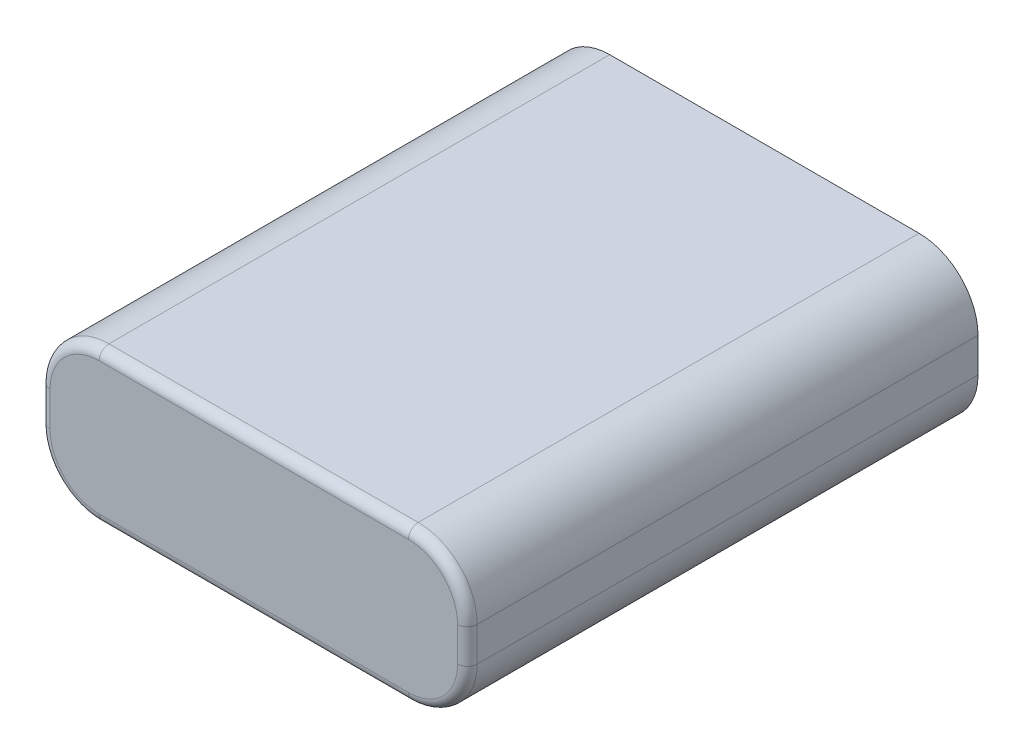
ISO-10303-21;
HEADER;
FILE_DESCRIPTION(('STEP AP214'),'2;1');
FILE_NAME('part.step','',(''),(''),'','','');
FILE_SCHEMA(('AUTOMOTIVE_DESIGN { 1 0 10303 214 1 1 1 1 }'));
ENDSEC;
DATA;
#1=APPLICATION_CONTEXT('core data for automotive mechanical design processes');
#2=APPLICATION_PROTOCOL_DEFINITION('international standard','automotive_design',2000,#1);
#3=PRODUCT_CONTEXT('',#1,'mechanical');
#4=PRODUCT('Part','Part','',(#3));
#5=PRODUCT_RELATED_PRODUCT_CATEGORY('part','',(#4));
#6=PRODUCT_DEFINITION_FORMATION('','',#4);
#7=PRODUCT_DEFINITION_CONTEXT('part definition',#1,'design');
#8=PRODUCT_DEFINITION('design','',#6,#7);
#9=PRODUCT_DEFINITION_SHAPE('','',#8);
#10=(LENGTH_UNIT() NAMED_UNIT(*) SI_UNIT(.MILLI.,.METRE.));
#11=(NAMED_UNIT(*) PLANE_ANGLE_UNIT() SI_UNIT($,.RADIAN.));
#12=(NAMED_UNIT(*) SI_UNIT($,.STERADIAN.) SOLID_ANGLE_UNIT());
#13=UNCERTAINTY_MEASURE_WITH_UNIT(LENGTH_MEASURE(1.E-05),#10,'distance_accuracy_value','');
#14=(GEOMETRIC_REPRESENTATION_CONTEXT(3) GLOBAL_UNCERTAINTY_ASSIGNED_CONTEXT((#13)) GLOBAL_UNIT_ASSIGNED_CONTEXT((#10,
#11,#12)) REPRESENTATION_CONTEXT('',''));
#15=CARTESIAN_POINT('',(0.,0.,0.));
#16=DIRECTION('',(0.,0.,1.));
#17=DIRECTION('',(1.,0.,0.));
#18=AXIS2_PLACEMENT_3D('',#15,#16,#17);
#19=CARTESIAN_POINT('',(15.75,1.75,52.));
#20=DIRECTION('',(0.,0.,-1.));
#21=DIRECTION('',(-1.,0.,0.));
#22=AXIS2_PLACEMENT_3D('',#19,#20,#21);
#23=CYLINDRICAL_SURFACE('',#22,6.);
#24=DIRECTION('',(0.,0.,-1.));
#25=VECTOR('',#24,1.);
#26=CARTESIAN_POINT('',(15.75,7.75,52.));
#27=LINE('',#26,#25);
#28=CARTESIAN_POINT('',(15.75,7.75,51.));
#29=VERTEX_POINT('',#28);
#30=CARTESIAN_POINT('',(15.75,7.75,0.));
#31=VERTEX_POINT('',#30);
#32=EDGE_CURVE('E122',#29,#31,#27,.T.);
#33=ORIENTED_EDGE('',*,*,#32,.F.);
#34=CARTESIAN_POINT('',(15.75,1.75,51.));
#35=DIRECTION('',(0.,0.,-1.));
#36=DIRECTION('',(-1.,0.,0.));
#37=AXIS2_PLACEMENT_3D('',#34,#35,#36);
#38=CIRCLE('',#37,6.);
#39=CARTESIAN_POINT('',(21.75,1.75,51.));
#40=VERTEX_POINT('',#39);
#41=EDGE_CURVE('E194',#29,#40,#38,.T.);
#42=ORIENTED_EDGE('',*,*,#41,.T.);
#43=DIRECTION('',(0.,0.,-1.));
#44=VECTOR('',#43,1.);
#45=CARTESIAN_POINT('',(21.75,1.75,52.));
#46=LINE('',#45,#44);
#47=CARTESIAN_POINT('',(21.75,1.75,0.));
#48=VERTEX_POINT('',#47);
#49=EDGE_CURVE('E145',#40,#48,#46,.T.);
#50=ORIENTED_EDGE('',*,*,#49,.T.);
#51=CARTESIAN_POINT('',(15.75,1.75,0.));
#52=DIRECTION('',(0.,0.,1.));
#53=DIRECTION('',(-1.,0.,0.));
#54=AXIS2_PLACEMENT_3D('',#51,#52,#53);
#55=CIRCLE('',#54,6.);
#56=EDGE_CURVE('E139',#48,#31,#55,.T.);
#57=ORIENTED_EDGE('',*,*,#56,.T.);
#58=EDGE_LOOP('',(#33,#42,#50,#57));
#59=FACE_BOUND('',#58,.T.);
#60=ADVANCED_FACE('F32',(#59),#23,.T.);
#61=CARTESIAN_POINT('',(-15.75,7.75,52.));
#62=DIRECTION('',(0.,-1.,0.));
#63=DIRECTION('',(0.,0.,-1.));
#64=AXIS2_PLACEMENT_3D('',#61,#62,#63);
#65=PLANE('',#64);
#66=DIRECTION('',(0.,0.,-1.));
#67=VECTOR('',#66,1.);
#68=CARTESIAN_POINT('',(-15.75,7.75,52.));
#69=LINE('',#68,#67);
#70=CARTESIAN_POINT('',(-15.75,7.75,51.));
#71=VERTEX_POINT('',#70);
#72=CARTESIAN_POINT('',(-15.75,7.75,0.));
#73=VERTEX_POINT('',#72);
#74=EDGE_CURVE('E133',#71,#73,#69,.T.);
#75=ORIENTED_EDGE('',*,*,#74,.F.);
#76=DIRECTION('',(-1.,0.,0.));
#77=VECTOR('',#76,1.);
#78=CARTESIAN_POINT('',(-15.75,7.75,51.));
#79=LINE('',#78,#77);
#80=EDGE_CURVE('E11',#71,#29,#79,.F.);
#81=ORIENTED_EDGE('',*,*,#80,.T.);
#82=ORIENTED_EDGE('',*,*,#32,.T.);
#83=DIRECTION('',(-1.,0.,0.));
#84=VECTOR('',#83,1.);
#85=CARTESIAN_POINT('',(-15.75,7.75,0.));
#86=LINE('',#85,#84);
#87=EDGE_CURVE('E125',#31,#73,#86,.T.);
#88=ORIENTED_EDGE('',*,*,#87,.T.);
#89=EDGE_LOOP('',(#75,#81,#82,#88));
#90=FACE_BOUND('',#89,.T.);
#91=ADVANCED_FACE('F124',(#90),#65,.F.);
#92=CARTESIAN_POINT('',(-15.75,1.75,52.));
#93=DIRECTION('',(0.,0.,-1.));
#94=DIRECTION('',(-1.,0.,0.));
#95=AXIS2_PLACEMENT_3D('',#92,#93,#94);
#96=CYLINDRICAL_SURFACE('',#95,6.);
#97=DIRECTION('',(0.,0.,-1.));
#98=VECTOR('',#97,1.);
#99=CARTESIAN_POINT('',(-21.75,1.75,52.));
#100=LINE('',#99,#98);
#101=CARTESIAN_POINT('',(-21.75,1.75,51.));
#102=VERTEX_POINT('',#101);
#103=CARTESIAN_POINT('',(-21.75,1.75,0.));
#104=VERTEX_POINT('',#103);
#105=EDGE_CURVE('E175',#102,#104,#100,.T.);
#106=ORIENTED_EDGE('',*,*,#105,.F.);
#107=CARTESIAN_POINT('',(-15.75,1.75,51.));
#108=DIRECTION('',(0.,0.,-1.));
#109=DIRECTION('',(-1.,0.,0.));
#110=AXIS2_PLACEMENT_3D('',#107,#108,#109);
#111=CIRCLE('',#110,6.);
#112=EDGE_CURVE('E41',#102,#71,#111,.T.);
#113=ORIENTED_EDGE('',*,*,#112,.T.);
#114=ORIENTED_EDGE('',*,*,#74,.T.);
#115=CARTESIAN_POINT('',(-15.75,1.75,0.));
#116=DIRECTION('',(0.,0.,1.));
#117=DIRECTION('',(-1.,0.,0.));
#118=AXIS2_PLACEMENT_3D('',#115,#116,#117);
#119=CIRCLE('',#118,6.);
#120=EDGE_CURVE('E142',#73,#104,#119,.T.);
#121=ORIENTED_EDGE('',*,*,#120,.T.);
#122=EDGE_LOOP('',(#106,#113,#114,#121));
#123=FACE_BOUND('',#122,.T.);
#124=ADVANCED_FACE('F265',(#123),#96,.T.);
#125=CARTESIAN_POINT('',(-21.75,-1.75,52.));
#126=DIRECTION('',(1.,0.,0.));
#127=DIRECTION('',(0.,0.,-1.));
#128=AXIS2_PLACEMENT_3D('',#125,#126,#127);
#129=PLANE('',#128);
#130=DIRECTION('',(0.,0.,-1.));
#131=VECTOR('',#130,1.);
#132=CARTESIAN_POINT('',(-21.75,-1.75,52.));
#133=LINE('',#132,#131);
#134=CARTESIAN_POINT('',(-21.75,-1.75,51.));
#135=VERTEX_POINT('',#134);
#136=CARTESIAN_POINT('',(-21.75,-1.75,0.));
#137=VERTEX_POINT('',#136);
#138=EDGE_CURVE('E173',#135,#137,#133,.T.);
#139=ORIENTED_EDGE('',*,*,#138,.F.);
#140=DIRECTION('',(0.,-1.,0.));
#141=VECTOR('',#140,1.);
#142=CARTESIAN_POINT('',(-21.75,-1.75,51.));
#143=LINE('',#142,#141);
#144=EDGE_CURVE('E56',#135,#102,#143,.F.);
#145=ORIENTED_EDGE('',*,*,#144,.T.);
#146=ORIENTED_EDGE('',*,*,#105,.T.);
#147=DIRECTION('',(0.,-1.,0.));
#148=VECTOR('',#147,1.);
#149=CARTESIAN_POINT('',(-21.75,-1.75,0.));
#150=LINE('',#149,#148);
#151=EDGE_CURVE('E152',#104,#137,#150,.T.);
#152=ORIENTED_EDGE('',*,*,#151,.T.);
#153=EDGE_LOOP('',(#139,#145,#146,#152));
#154=FACE_BOUND('',#153,.T.);
#155=ADVANCED_FACE('F264',(#154),#129,.F.);
#156=CARTESIAN_POINT('',(-15.75,-1.75,52.));
#157=DIRECTION('',(0.,0.,-1.));
#158=DIRECTION('',(-1.,0.,0.));
#159=AXIS2_PLACEMENT_3D('',#156,#157,#158);
#160=CYLINDRICAL_SURFACE('',#159,6.);
#161=DIRECTION('',(0.,0.,-1.));
#162=VECTOR('',#161,1.);
#163=CARTESIAN_POINT('',(-15.75,-7.75,52.));
#164=LINE('',#163,#162);
#165=CARTESIAN_POINT('',(-15.75,-7.75,51.));
#166=VERTEX_POINT('',#165);
#167=CARTESIAN_POINT('',(-15.75,-7.75,0.));
#168=VERTEX_POINT('',#167);
#169=EDGE_CURVE('E171',#166,#168,#164,.T.);
#170=ORIENTED_EDGE('',*,*,#169,.F.);
#171=CARTESIAN_POINT('',(-15.75,-1.75,51.));
#172=DIRECTION('',(0.,0.,-1.));
#173=DIRECTION('',(-1.,0.,0.));
#174=AXIS2_PLACEMENT_3D('',#171,#172,#173);
#175=CIRCLE('',#174,6.);
#176=EDGE_CURVE('E202',#166,#135,#175,.T.);
#177=ORIENTED_EDGE('',*,*,#176,.T.);
#178=ORIENTED_EDGE('',*,*,#138,.T.);
#179=CARTESIAN_POINT('',(-15.75,-1.75,0.));
#180=DIRECTION('',(0.,0.,1.));
#181=DIRECTION('',(-1.,0.,0.));
#182=AXIS2_PLACEMENT_3D('',#179,#180,#181);
#183=CIRCLE('',#182,6.);
#184=EDGE_CURVE('E155',#137,#168,#183,.T.);
#185=ORIENTED_EDGE('',*,*,#184,.T.);
#186=EDGE_LOOP('',(#170,#177,#178,#185));
#187=FACE_BOUND('',#186,.T.);
#188=ADVANCED_FACE('F263',(#187),#160,.T.);
#189=CARTESIAN_POINT('',(-15.75,-7.75,52.));
#190=DIRECTION('',(0.,1.,0.));
#191=DIRECTION('',(0.,0.,1.));
#192=AXIS2_PLACEMENT_3D('',#189,#190,#191);
#193=PLANE('',#192);
#194=DIRECTION('',(0.,0.,-1.));
#195=VECTOR('',#194,1.);
#196=CARTESIAN_POINT('',(15.75,-7.75,52.));
#197=LINE('',#196,#195);
#198=CARTESIAN_POINT('',(15.75,-7.75,51.));
#199=VERTEX_POINT('',#198);
#200=CARTESIAN_POINT('',(15.75,-7.75,0.));
#201=VERTEX_POINT('',#200);
#202=EDGE_CURVE('E169',#199,#201,#197,.T.);
#203=ORIENTED_EDGE('',*,*,#202,.F.);
#204=DIRECTION('',(1.,0.,0.));
#205=VECTOR('',#204,1.);
#206=CARTESIAN_POINT('',(-15.75,-7.75,51.));
#207=LINE('',#206,#205);
#208=EDGE_CURVE('E200',#199,#166,#207,.F.);
#209=ORIENTED_EDGE('',*,*,#208,.T.);
#210=ORIENTED_EDGE('',*,*,#169,.T.);
#211=DIRECTION('',(1.,0.,0.));
#212=VECTOR('',#211,1.);
#213=CARTESIAN_POINT('',(-15.75,-7.75,0.));
#214=LINE('',#213,#212);
#215=EDGE_CURVE('E158',#168,#201,#214,.T.);
#216=ORIENTED_EDGE('',*,*,#215,.T.);
#217=EDGE_LOOP('',(#203,#209,#210,#216));
#218=FACE_BOUND('',#217,.T.);
#219=ADVANCED_FACE('F260',(#218),#193,.F.);
#220=CARTESIAN_POINT('',(15.75,-1.75,52.));
#221=DIRECTION('',(0.,0.,-1.));
#222=DIRECTION('',(-1.,0.,0.));
#223=AXIS2_PLACEMENT_3D('',#220,#221,#222);
#224=CYLINDRICAL_SURFACE('',#223,6.);
#225=DIRECTION('',(0.,0.,-1.));
#226=VECTOR('',#225,1.);
#227=CARTESIAN_POINT('',(21.75,-1.75,52.));
#228=LINE('',#227,#226);
#229=CARTESIAN_POINT('',(21.75,-1.75,51.));
#230=VERTEX_POINT('',#229);
#231=CARTESIAN_POINT('',(21.75,-1.75,0.));
#232=VERTEX_POINT('',#231);
#233=EDGE_CURVE('E167',#230,#232,#228,.T.);
#234=ORIENTED_EDGE('',*,*,#233,.F.);
#235=CARTESIAN_POINT('',(15.75,-1.75,51.));
#236=DIRECTION('',(0.,0.,-1.));
#237=DIRECTION('',(-1.,0.,0.));
#238=AXIS2_PLACEMENT_3D('',#235,#236,#237);
#239=CIRCLE('',#238,6.);
#240=EDGE_CURVE('E198',#230,#199,#239,.T.);
#241=ORIENTED_EDGE('',*,*,#240,.T.);
#242=ORIENTED_EDGE('',*,*,#202,.T.);
#243=CARTESIAN_POINT('',(15.75,-1.75,0.));
#244=DIRECTION('',(0.,0.,1.));
#245=DIRECTION('',(1.,0.,0.));
#246=AXIS2_PLACEMENT_3D('',#243,#244,#245);
#247=CIRCLE('',#246,6.);
#248=EDGE_CURVE('E161',#201,#232,#247,.T.);
#249=ORIENTED_EDGE('',*,*,#248,.T.);
#250=EDGE_LOOP('',(#234,#241,#242,#249));
#251=FACE_BOUND('',#250,.T.);
#252=ADVANCED_FACE('F255',(#251),#224,.T.);
#253=CARTESIAN_POINT('',(21.75,-1.75,52.));
#254=DIRECTION('',(-1.,0.,0.));
#255=DIRECTION('',(0.,0.,1.));
#256=AXIS2_PLACEMENT_3D('',#253,#254,#255);
#257=PLANE('',#256);
#258=ORIENTED_EDGE('',*,*,#49,.F.);
#259=DIRECTION('',(0.,1.,0.));
#260=VECTOR('',#259,1.);
#261=CARTESIAN_POINT('',(21.75,-1.75,51.));
#262=LINE('',#261,#260);
#263=EDGE_CURVE('E196',#40,#230,#262,.F.);
#264=ORIENTED_EDGE('',*,*,#263,.T.);
#265=ORIENTED_EDGE('',*,*,#233,.T.);
#266=DIRECTION('',(0.,1.,0.));
#267=VECTOR('',#266,1.);
#268=CARTESIAN_POINT('',(21.75,-1.75,0.));
#269=LINE('',#268,#267);
#270=EDGE_CURVE('E164',#232,#48,#269,.T.);
#271=ORIENTED_EDGE('',*,*,#270,.T.);
#272=EDGE_LOOP('',(#258,#264,#265,#271));
#273=FACE_BOUND('',#272,.T.);
#274=ADVANCED_FACE('F249',(#273),#257,.F.);
#275=CARTESIAN_POINT('',(15.75,1.75,52.));
#276=DIRECTION('',(0.,0.,-1.));
#277=DIRECTION('',(-1.,0.,0.));
#278=AXIS2_PLACEMENT_3D('',#275,#276,#277);
#279=PLANE('',#278);
#280=DIRECTION('',(0.,1.,0.));
#281=VECTOR('',#280,1.);
#282=CARTESIAN_POINT('',(20.75,1.75,52.));
#283=LINE('',#282,#281);
#284=CARTESIAN_POINT('',(20.75,-1.75,52.));
#285=VERTEX_POINT('',#284);
#286=CARTESIAN_POINT('',(20.75,1.75,52.));
#287=VERTEX_POINT('',#286);
#288=EDGE_CURVE('E189',#285,#287,#283,.T.);
#289=ORIENTED_EDGE('',*,*,#288,.T.);
#290=CARTESIAN_POINT('',(15.75,1.75,52.));
#291=DIRECTION('',(0.,0.,-1.));
#292=DIRECTION('',(-1.,0.,0.));
#293=AXIS2_PLACEMENT_3D('',#290,#291,#292);
#294=CIRCLE('',#293,5.);
#295=CARTESIAN_POINT('',(15.75,6.75,52.));
#296=VERTEX_POINT('',#295);
#297=EDGE_CURVE('E191',#287,#296,#294,.F.);
#298=ORIENTED_EDGE('',*,*,#297,.T.);
#299=DIRECTION('',(-1.,0.,0.));
#300=VECTOR('',#299,1.);
#301=CARTESIAN_POINT('',(15.75,6.75,52.));
#302=LINE('',#301,#300);
#303=CARTESIAN_POINT('',(-15.75,6.75,52.));
#304=VERTEX_POINT('',#303);
#305=EDGE_CURVE('E132',#296,#304,#302,.T.);
#306=ORIENTED_EDGE('',*,*,#305,.T.);
#307=CARTESIAN_POINT('',(-15.75,1.75,52.));
#308=DIRECTION('',(0.,0.,-1.));
#309=DIRECTION('',(-1.,0.,0.));
#310=AXIS2_PLACEMENT_3D('',#307,#308,#309);
#311=CIRCLE('',#310,5.);
#312=CARTESIAN_POINT('',(-20.75,1.75,52.));
#313=VERTEX_POINT('',#312);
#314=EDGE_CURVE('E179',#304,#313,#311,.F.);
#315=ORIENTED_EDGE('',*,*,#314,.T.);
#316=DIRECTION('',(0.,-1.,0.));
#317=VECTOR('',#316,1.);
#318=CARTESIAN_POINT('',(-20.75,1.75,52.));
#319=LINE('',#318,#317);
#320=CARTESIAN_POINT('',(-20.75,-1.75,52.));
#321=VERTEX_POINT('',#320);
#322=EDGE_CURVE('E181',#313,#321,#319,.T.);
#323=ORIENTED_EDGE('',*,*,#322,.T.);
#324=CARTESIAN_POINT('',(-15.75,-1.75,52.));
#325=DIRECTION('',(0.,0.,-1.));
#326=DIRECTION('',(-1.,0.,0.));
#327=AXIS2_PLACEMENT_3D('',#324,#325,#326);
#328=CIRCLE('',#327,5.);
#329=CARTESIAN_POINT('',(-15.75,-6.75,52.));
#330=VERTEX_POINT('',#329);
#331=EDGE_CURVE('E183',#321,#330,#328,.F.);
#332=ORIENTED_EDGE('',*,*,#331,.T.);
#333=DIRECTION('',(1.,0.,0.));
#334=VECTOR('',#333,1.);
#335=CARTESIAN_POINT('',(15.75,-6.75,52.));
#336=LINE('',#335,#334);
#337=CARTESIAN_POINT('',(15.75,-6.75,52.));
#338=VERTEX_POINT('',#337);
#339=EDGE_CURVE('E185',#330,#338,#336,.T.);
#340=ORIENTED_EDGE('',*,*,#339,.T.);
#341=CARTESIAN_POINT('',(15.75,-1.75,52.));
#342=DIRECTION('',(0.,0.,-1.));
#343=DIRECTION('',(-1.,0.,0.));
#344=AXIS2_PLACEMENT_3D('',#341,#342,#343);
#345=CIRCLE('',#344,5.);
#346=EDGE_CURVE('E187',#338,#285,#345,.F.);
#347=ORIENTED_EDGE('',*,*,#346,.T.);
#348=EDGE_LOOP('',(#289,#298,#306,#315,#323,#332,#340,#347));
#349=FACE_BOUND('',#348,.T.);
#350=ADVANCED_FACE('F233',(#349),#279,.F.);
#351=CARTESIAN_POINT('',(15.75,1.75,0.));
#352=DIRECTION('',(0.,0.,-1.));
#353=DIRECTION('',(-1.,0.,0.));
#354=AXIS2_PLACEMENT_3D('',#351,#352,#353);
#355=PLANE('',#354);
#356=ORIENTED_EDGE('',*,*,#56,.F.);
#357=ORIENTED_EDGE('',*,*,#270,.F.);
#358=ORIENTED_EDGE('',*,*,#248,.F.);
#359=ORIENTED_EDGE('',*,*,#215,.F.);
#360=ORIENTED_EDGE('',*,*,#184,.F.);
#361=ORIENTED_EDGE('',*,*,#151,.F.);
#362=ORIENTED_EDGE('',*,*,#120,.F.);
#363=ORIENTED_EDGE('',*,*,#87,.F.);
#364=EDGE_LOOP('',(#356,#357,#358,#359,#360,#361,#362,#363));
#365=FACE_BOUND('',#364,.T.);
#366=ADVANCED_FACE('F137',(#365),#355,.T.);
#367=CARTESIAN_POINT('',(-15.75,-1.75,51.));
#368=DIRECTION('',(0.,0.,-1.));
#369=DIRECTION('',(-1.,0.,0.));
#370=AXIS2_PLACEMENT_3D('',#367,#368,#369);
#371=TOROIDAL_SURFACE('',#370,5.,1.);
#372=CARTESIAN_POINT('',(-20.75,-1.75,51.));
#373=DIRECTION('',(0.,1.,0.));
#374=DIRECTION('',(0.,0.,1.));
#375=AXIS2_PLACEMENT_3D('',#372,#373,#374);
#376=CIRCLE('',#375,1.);
#377=EDGE_CURVE('E149',#135,#321,#376,.T.);
#378=ORIENTED_EDGE('',*,*,#377,.F.);
#379=ORIENTED_EDGE('',*,*,#176,.F.);
#380=CARTESIAN_POINT('',(-15.75,-6.75,51.));
#381=DIRECTION('',(1.,0.,0.));
#382=DIRECTION('',(0.,0.,-1.));
#383=AXIS2_PLACEMENT_3D('',#380,#381,#382);
#384=CIRCLE('',#383,1.);
#385=EDGE_CURVE('E36',#330,#166,#384,.T.);
#386=ORIENTED_EDGE('',*,*,#385,.F.);
#387=ORIENTED_EDGE('',*,*,#331,.F.);
#388=EDGE_LOOP('',(#378,#379,#386,#387));
#389=FACE_BOUND('',#388,.T.);
#390=ADVANCED_FACE('F34',(#389),#371,.T.);
#391=CARTESIAN_POINT('',(15.75,-6.75,51.));
#392=DIRECTION('',(1.,0.,0.));
#393=DIRECTION('',(0.,0.,-1.));
#394=AXIS2_PLACEMENT_3D('',#391,#392,#393);
#395=CYLINDRICAL_SURFACE('',#394,1.);
#396=ORIENTED_EDGE('',*,*,#385,.T.);
#397=ORIENTED_EDGE('',*,*,#208,.F.);
#398=CARTESIAN_POINT('',(15.75,-6.75,51.));
#399=DIRECTION('',(1.,0.,0.));
#400=DIRECTION('',(0.,0.,-1.));
#401=AXIS2_PLACEMENT_3D('',#398,#399,#400);
#402=CIRCLE('',#401,1.);
#403=EDGE_CURVE('E219',#338,#199,#402,.T.);
#404=ORIENTED_EDGE('',*,*,#403,.F.);
#405=ORIENTED_EDGE('',*,*,#339,.F.);
#406=EDGE_LOOP('',(#396,#397,#404,#405));
#407=FACE_BOUND('',#406,.T.);
#408=ADVANCED_FACE('F294',(#407),#395,.T.);
#409=CARTESIAN_POINT('',(-20.75,1.75,51.));
#410=DIRECTION('',(0.,-1.,0.));
#411=DIRECTION('',(0.,0.,-1.));
#412=AXIS2_PLACEMENT_3D('',#409,#410,#411);
#413=CYLINDRICAL_SURFACE('',#412,1.);
#414=ORIENTED_EDGE('',*,*,#377,.T.);
#415=ORIENTED_EDGE('',*,*,#322,.F.);
#416=CARTESIAN_POINT('',(-20.75,1.75,51.));
#417=DIRECTION('',(0.,1.,0.));
#418=DIRECTION('',(0.,0.,1.));
#419=AXIS2_PLACEMENT_3D('',#416,#417,#418);
#420=CIRCLE('',#419,1.);
#421=EDGE_CURVE('E216',#102,#313,#420,.T.);
#422=ORIENTED_EDGE('',*,*,#421,.F.);
#423=ORIENTED_EDGE('',*,*,#144,.F.);
#424=EDGE_LOOP('',(#414,#415,#422,#423));
#425=FACE_BOUND('',#424,.T.);
#426=ADVANCED_FACE('F225',(#425),#413,.T.);
#427=CARTESIAN_POINT('',(15.75,-1.75,51.));
#428=DIRECTION('',(0.,0.,-1.));
#429=DIRECTION('',(-1.,0.,0.));
#430=AXIS2_PLACEMENT_3D('',#427,#428,#429);
#431=TOROIDAL_SURFACE('',#430,5.,1.);
#432=ORIENTED_EDGE('',*,*,#403,.T.);
#433=ORIENTED_EDGE('',*,*,#240,.F.);
#434=CARTESIAN_POINT('',(20.75,-1.75,51.));
#435=DIRECTION('',(0.,1.,0.));
#436=DIRECTION('',(0.,0.,1.));
#437=AXIS2_PLACEMENT_3D('',#434,#435,#436);
#438=CIRCLE('',#437,1.);
#439=EDGE_CURVE('E213',#285,#230,#438,.T.);
#440=ORIENTED_EDGE('',*,*,#439,.F.);
#441=ORIENTED_EDGE('',*,*,#346,.F.);
#442=EDGE_LOOP('',(#432,#433,#440,#441));
#443=FACE_BOUND('',#442,.T.);
#444=ADVANCED_FACE('F289',(#443),#431,.T.);
#445=CARTESIAN_POINT('',(-15.75,1.75,51.));
#446=DIRECTION('',(0.,0.,-1.));
#447=DIRECTION('',(-1.,0.,0.));
#448=AXIS2_PLACEMENT_3D('',#445,#446,#447);
#449=TOROIDAL_SURFACE('',#448,5.,1.);
#450=ORIENTED_EDGE('',*,*,#421,.T.);
#451=ORIENTED_EDGE('',*,*,#314,.F.);
#452=CARTESIAN_POINT('',(-15.75,6.75,51.));
#453=DIRECTION('',(1.,0.,0.));
#454=DIRECTION('',(0.,0.,-1.));
#455=AXIS2_PLACEMENT_3D('',#452,#453,#454);
#456=CIRCLE('',#455,1.);
#457=EDGE_CURVE('E210',#71,#304,#456,.T.);
#458=ORIENTED_EDGE('',*,*,#457,.F.);
#459=ORIENTED_EDGE('',*,*,#112,.F.);
#460=EDGE_LOOP('',(#450,#451,#458,#459));
#461=FACE_BOUND('',#460,.T.);
#462=ADVANCED_FACE('F239',(#461),#449,.T.);
#463=CARTESIAN_POINT('',(20.75,1.75,51.));
#464=DIRECTION('',(0.,1.,0.));
#465=DIRECTION('',(0.,0.,1.));
#466=AXIS2_PLACEMENT_3D('',#463,#464,#465);
#467=CYLINDRICAL_SURFACE('',#466,1.);
#468=ORIENTED_EDGE('',*,*,#439,.T.);
#469=ORIENTED_EDGE('',*,*,#263,.F.);
#470=CARTESIAN_POINT('',(20.75,1.75,51.));
#471=DIRECTION('',(0.,1.,0.));
#472=DIRECTION('',(0.,0.,1.));
#473=AXIS2_PLACEMENT_3D('',#470,#471,#472);
#474=CIRCLE('',#473,1.);
#475=EDGE_CURVE('E208',#287,#40,#474,.T.);
#476=ORIENTED_EDGE('',*,*,#475,.F.);
#477=ORIENTED_EDGE('',*,*,#288,.F.);
#478=EDGE_LOOP('',(#468,#469,#476,#477));
#479=FACE_BOUND('',#478,.T.);
#480=ADVANCED_FACE('F283',(#479),#467,.T.);
#481=CARTESIAN_POINT('',(15.75,6.75,51.));
#482=DIRECTION('',(-1.,0.,0.));
#483=DIRECTION('',(0.,0.,1.));
#484=AXIS2_PLACEMENT_3D('',#481,#482,#483);
#485=CYLINDRICAL_SURFACE('',#484,1.);
#486=ORIENTED_EDGE('',*,*,#457,.T.);
#487=ORIENTED_EDGE('',*,*,#305,.F.);
#488=CARTESIAN_POINT('',(15.75,6.75,51.));
#489=DIRECTION('',(1.,0.,0.));
#490=DIRECTION('',(0.,0.,-1.));
#491=AXIS2_PLACEMENT_3D('',#488,#489,#490);
#492=CIRCLE('',#491,1.);
#493=EDGE_CURVE('E206',#29,#296,#492,.T.);
#494=ORIENTED_EDGE('',*,*,#493,.F.);
#495=ORIENTED_EDGE('',*,*,#80,.F.);
#496=EDGE_LOOP('',(#486,#487,#494,#495));
#497=FACE_BOUND('',#496,.T.);
#498=ADVANCED_FACE('F241',(#497),#485,.T.);
#499=CARTESIAN_POINT('',(15.75,1.75,51.));
#500=DIRECTION('',(0.,0.,-1.));
#501=DIRECTION('',(-1.,0.,0.));
#502=AXIS2_PLACEMENT_3D('',#499,#500,#501);
#503=TOROIDAL_SURFACE('',#502,5.,1.);
#504=ORIENTED_EDGE('',*,*,#475,.T.);
#505=ORIENTED_EDGE('',*,*,#41,.F.);
#506=ORIENTED_EDGE('',*,*,#493,.T.);
#507=ORIENTED_EDGE('',*,*,#297,.F.);
#508=EDGE_LOOP('',(#504,#505,#506,#507));
#509=FACE_BOUND('',#508,.T.);
#510=ADVANCED_FACE('F245',(#509),#503,.T.);
#511=CLOSED_SHELL('',(#60,#91,#124,#155,#188,#219,#252,#274,#350,#366,#390,#408,#426,#444,#462,
#480,#498,#510));
#512=MANIFOLD_SOLID_BREP('B2',#511);
#513=ADVANCED_BREP_SHAPE_REPRESENTATION('',(#18,#512),#14);
#514=SHAPE_DEFINITION_REPRESENTATION(#9,#513);
ENDSEC;
END-ISO-10303-21;
